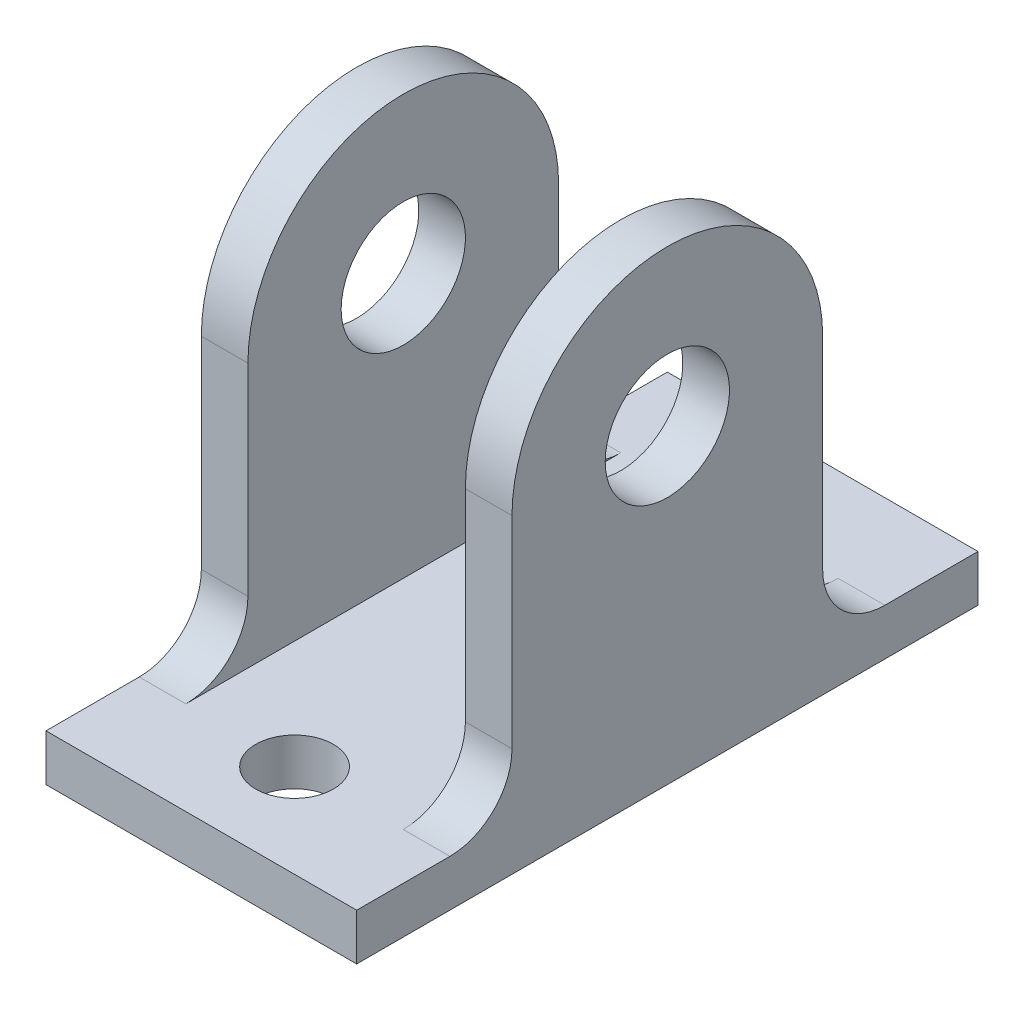
ISO-10303-21;
HEADER;
FILE_DESCRIPTION(('STEP AP214'),'2;1');
FILE_NAME('part.step','',(''),(''),'','','');
FILE_SCHEMA(('AUTOMOTIVE_DESIGN { 1 0 10303 214 1 1 1 1 }'));
ENDSEC;
DATA;
#1=APPLICATION_CONTEXT('core data for automotive mechanical design processes');
#2=APPLICATION_PROTOCOL_DEFINITION('international standard','automotive_design',2000,#1);
#3=PRODUCT_CONTEXT('',#1,'mechanical');
#4=PRODUCT('Part','Part','',(#3));
#5=PRODUCT_RELATED_PRODUCT_CATEGORY('part','',(#4));
#6=PRODUCT_DEFINITION_FORMATION('','',#4);
#7=PRODUCT_DEFINITION_CONTEXT('part definition',#1,'design');
#8=PRODUCT_DEFINITION('design','',#6,#7);
#9=PRODUCT_DEFINITION_SHAPE('','',#8);
#10=(LENGTH_UNIT() NAMED_UNIT(*) SI_UNIT(.MILLI.,.METRE.));
#11=(NAMED_UNIT(*) PLANE_ANGLE_UNIT() SI_UNIT($,.RADIAN.));
#12=(NAMED_UNIT(*) SI_UNIT($,.STERADIAN.) SOLID_ANGLE_UNIT());
#13=UNCERTAINTY_MEASURE_WITH_UNIT(LENGTH_MEASURE(1.E-05),#10,'distance_accuracy_value','');
#14=(GEOMETRIC_REPRESENTATION_CONTEXT(3) GLOBAL_UNCERTAINTY_ASSIGNED_CONTEXT((#13)) GLOBAL_UNIT_ASSIGNED_CONTEXT((#10,
#11,#12)) REPRESENTATION_CONTEXT('',''));
#15=CARTESIAN_POINT('',(0.,0.,0.));
#16=DIRECTION('',(0.,0.,1.));
#17=DIRECTION('',(1.,0.,0.));
#18=AXIS2_PLACEMENT_3D('',#15,#16,#17);
#19=CARTESIAN_POINT('',(7.21739130434782,-10.4021739130435,20.));
#20=DIRECTION('',(1.,0.,0.));
#21=DIRECTION('',(0.,1.,0.));
#22=AXIS2_PLACEMENT_3D('',#19,#20,#21);
#23=PLANE('',#22);
#24=CARTESIAN_POINT('',(7.21739130434782,-1.90217391304348,10.));
#25=DIRECTION('',(-1.,0.,0.));
#26=DIRECTION('',(0.,0.,1.));
#27=AXIS2_PLACEMENT_3D('',#24,#25,#26);
#28=CIRCLE('',#27,5.);
#29=CARTESIAN_POINT('',(7.21739130434782,-1.90217391304348,5.));
#30=VERTEX_POINT('',#29);
#31=CARTESIAN_POINT('',(7.21739130434782,-1.90217391304348,15.));
#32=VERTEX_POINT('',#31);
#33=EDGE_CURVE('E230',#30,#32,#28,.F.);
#34=ORIENTED_EDGE('',*,*,#33,.F.);
#35=DIRECTION('',(0.,1.,0.));
#36=VECTOR('',#35,1.);
#37=CARTESIAN_POINT('',(7.21739130434782,0.,5.));
#38=LINE('',#37,#36);
#39=CARTESIAN_POINT('',(7.21739130434782,-8.40217391304348,5.));
#40=VERTEX_POINT('',#39);
#41=EDGE_CURVE('E246',#30,#40,#38,.F.);
#42=ORIENTED_EDGE('',*,*,#41,.T.);
#43=CARTESIAN_POINT('',(7.21739130434782,-8.40217391304348,3.));
#44=DIRECTION('',(1.,0.,0.));
#45=DIRECTION('',(0.,0.,-1.));
#46=AXIS2_PLACEMENT_3D('',#43,#44,#45);
#47=CIRCLE('',#46,2.);
#48=CARTESIAN_POINT('',(7.21739130434782,-10.4021739130435,3.));
#49=VERTEX_POINT('',#48);
#50=EDGE_CURVE('E239',#40,#49,#47,.T.);
#51=ORIENTED_EDGE('',*,*,#50,.T.);
#52=DIRECTION('',(0.,0.,-1.));
#53=VECTOR('',#52,1.);
#54=CARTESIAN_POINT('',(7.21739130434782,-10.4021739130435,20.));
#55=LINE('',#54,#53);
#56=CARTESIAN_POINT('',(7.21739130434782,-10.4021739130435,17.));
#57=VERTEX_POINT('',#56);
#58=EDGE_CURVE('E272',#49,#57,#55,.F.);
#59=ORIENTED_EDGE('',*,*,#58,.T.);
#60=CARTESIAN_POINT('',(7.21739130434782,-8.40217391304348,17.));
#61=DIRECTION('',(-1.,0.,0.));
#62=DIRECTION('',(0.,0.,1.));
#63=AXIS2_PLACEMENT_3D('',#60,#61,#62);
#64=CIRCLE('',#63,2.);
#65=CARTESIAN_POINT('',(7.21739130434782,-8.40217391304348,15.));
#66=VERTEX_POINT('',#65);
#67=EDGE_CURVE('E235',#57,#66,#64,.F.);
#68=ORIENTED_EDGE('',*,*,#67,.T.);
#69=DIRECTION('',(0.,-1.,0.));
#70=VECTOR('',#69,1.);
#71=CARTESIAN_POINT('',(7.21739130434782,0.,15.));
#72=LINE('',#71,#70);
#73=EDGE_CURVE('E165',#32,#66,#72,.T.);
#74=ORIENTED_EDGE('',*,*,#73,.F.);
#75=EDGE_LOOP('',(#34,#42,#51,#59,#68,#74));
#76=FACE_BOUND('',#75,.T.);
#77=CARTESIAN_POINT('',(7.21739130434782,-1.90217391304348,10.));
#78=DIRECTION('',(-1.,0.,0.));
#79=DIRECTION('',(0.,0.,1.));
#80=AXIS2_PLACEMENT_3D('',#77,#78,#79);
#81=CIRCLE('',#80,2.);
#82=CARTESIAN_POINT('',(7.21739130434782,-1.90217391304348,12.));
#83=VERTEX_POINT('',#82);
#84=EDGE_CURVE('E161',#83,#83,#81,.F.);
#85=ORIENTED_EDGE('',*,*,#84,.T.);
#86=EDGE_LOOP('',(#85));
#87=FACE_BOUND('',#86,.T.);
#88=ADVANCED_FACE('F17',(#76,#87),#23,.F.);
#89=CARTESIAN_POINT('',(0.217391304347819,3.09782608695652,20.));
#90=DIRECTION('',(-1.,0.,0.));
#91=DIRECTION('',(0.,-1.,0.));
#92=AXIS2_PLACEMENT_3D('',#89,#90,#91);
#93=PLANE('',#92);
#94=DIRECTION('',(0.,-1.,0.));
#95=VECTOR('',#94,1.);
#96=CARTESIAN_POINT('',(0.21739130434782,0.,15.));
#97=LINE('',#96,#95);
#98=CARTESIAN_POINT('',(0.21739130434782,-8.40217391304348,15.));
#99=VERTEX_POINT('',#98);
#100=CARTESIAN_POINT('',(0.217391304347819,-1.90217391304348,15.));
#101=VERTEX_POINT('',#100);
#102=EDGE_CURVE('E143',#99,#101,#97,.F.);
#103=ORIENTED_EDGE('',*,*,#102,.F.);
#104=CARTESIAN_POINT('',(0.21739130434782,-8.40217391304348,17.));
#105=DIRECTION('',(-1.,0.,0.));
#106=DIRECTION('',(0.,0.,1.));
#107=AXIS2_PLACEMENT_3D('',#104,#105,#106);
#108=CIRCLE('',#107,2.);
#109=CARTESIAN_POINT('',(0.217391304347821,-10.4021739130435,17.));
#110=VERTEX_POINT('',#109);
#111=EDGE_CURVE('E128',#99,#110,#108,.T.);
#112=ORIENTED_EDGE('',*,*,#111,.T.);
#113=DIRECTION('',(0.,0.,-1.));
#114=VECTOR('',#113,1.);
#115=CARTESIAN_POINT('',(0.217391304347821,-10.4021739130435,20.));
#116=LINE('',#115,#114);
#117=CARTESIAN_POINT('',(0.217391304347821,-10.4021739130435,3.));
#118=VERTEX_POINT('',#117);
#119=EDGE_CURVE('E261',#110,#118,#116,.T.);
#120=ORIENTED_EDGE('',*,*,#119,.T.);
#121=CARTESIAN_POINT('',(0.21739130434782,-8.40217391304348,3.));
#122=DIRECTION('',(1.,0.,0.));
#123=DIRECTION('',(0.,0.,-1.));
#124=AXIS2_PLACEMENT_3D('',#121,#122,#123);
#125=CIRCLE('',#124,2.);
#126=CARTESIAN_POINT('',(0.21739130434782,-8.40217391304348,5.));
#127=VERTEX_POINT('',#126);
#128=EDGE_CURVE('E140',#118,#127,#125,.F.);
#129=ORIENTED_EDGE('',*,*,#128,.T.);
#130=DIRECTION('',(0.,1.,0.));
#131=VECTOR('',#130,1.);
#132=CARTESIAN_POINT('',(0.21739130434782,0.,5.));
#133=LINE('',#132,#131);
#134=CARTESIAN_POINT('',(0.217391304347819,-1.90217391304348,5.));
#135=VERTEX_POINT('',#134);
#136=EDGE_CURVE('E167',#127,#135,#133,.T.);
#137=ORIENTED_EDGE('',*,*,#136,.T.);
#138=CARTESIAN_POINT('',(0.217391304347819,-1.90217391304348,10.));
#139=DIRECTION('',(-1.,0.,0.));
#140=DIRECTION('',(0.,0.,1.));
#141=AXIS2_PLACEMENT_3D('',#138,#139,#140);
#142=CIRCLE('',#141,5.);
#143=EDGE_CURVE('E153',#101,#135,#142,.T.);
#144=ORIENTED_EDGE('',*,*,#143,.F.);
#145=EDGE_LOOP('',(#103,#112,#120,#129,#137,#144));
#146=FACE_BOUND('',#145,.T.);
#147=CARTESIAN_POINT('',(0.217391304347819,-1.90217391304348,10.));
#148=DIRECTION('',(-1.,0.,0.));
#149=DIRECTION('',(0.,0.,1.));
#150=AXIS2_PLACEMENT_3D('',#147,#148,#149);
#151=CIRCLE('',#150,2.);
#152=CARTESIAN_POINT('',(0.217391304347819,-1.90217391304348,12.));
#153=VERTEX_POINT('',#152);
#154=EDGE_CURVE('E20',#153,#153,#151,.T.);
#155=ORIENTED_EDGE('',*,*,#154,.T.);
#156=EDGE_LOOP('',(#155));
#157=FACE_BOUND('',#156,.T.);
#158=ADVANCED_FACE('F150',(#146,#157),#93,.F.);
#159=CARTESIAN_POINT('',(8.71739130434782,-1.90217391304348,10.));
#160=DIRECTION('',(-1.,0.,0.));
#161=DIRECTION('',(0.,0.,1.));
#162=AXIS2_PLACEMENT_3D('',#159,#160,#161);
#163=CYLINDRICAL_SURFACE('',#162,2.);
#164=ORIENTED_EDGE('',*,*,#154,.F.);
#165=EDGE_LOOP('',(#164));
#166=FACE_BOUND('',#165,.T.);
#167=CARTESIAN_POINT('',(-1.28260869565218,-1.90217391304348,10.));
#168=DIRECTION('',(-1.,0.,0.));
#169=DIRECTION('',(0.,0.,1.));
#170=AXIS2_PLACEMENT_3D('',#167,#168,#169);
#171=CIRCLE('',#170,2.);
#172=CARTESIAN_POINT('',(-1.28260869565218,-1.90217391304348,12.));
#173=VERTEX_POINT('',#172);
#174=EDGE_CURVE('E217',#173,#173,#171,.T.);
#175=ORIENTED_EDGE('',*,*,#174,.T.);
#176=EDGE_LOOP('',(#175));
#177=FACE_BOUND('',#176,.T.);
#178=ADVANCED_FACE('F597',(#166,#177),#163,.F.);
#179=CARTESIAN_POINT('',(0.217391304347821,-8.40217391304348,17.));
#180=DIRECTION('',(-1.,0.,0.));
#181=DIRECTION('',(0.,0.,1.));
#182=AXIS2_PLACEMENT_3D('',#179,#180,#181);
#183=CYLINDRICAL_SURFACE('',#182,2.);
#184=DIRECTION('',(1.,0.,0.));
#185=VECTOR('',#184,1.);
#186=CARTESIAN_POINT('',(8.71739130434782,-8.40217391304348,15.));
#187=LINE('',#186,#185);
#188=CARTESIAN_POINT('',(-1.28260869565218,-8.40217391304348,15.));
#189=VERTEX_POINT('',#188);
#190=EDGE_CURVE('E132',#189,#99,#187,.T.);
#191=ORIENTED_EDGE('',*,*,#190,.F.);
#192=CARTESIAN_POINT('',(-1.28260869565218,-8.40217391304348,17.));
#193=DIRECTION('',(-1.,0.,0.));
#194=DIRECTION('',(0.,0.,1.));
#195=AXIS2_PLACEMENT_3D('',#192,#193,#194);
#196=CIRCLE('',#195,2.);
#197=CARTESIAN_POINT('',(-1.28260869565218,-10.4021739130435,17.));
#198=VERTEX_POINT('',#197);
#199=EDGE_CURVE('E213',#189,#198,#196,.T.);
#200=ORIENTED_EDGE('',*,*,#199,.T.);
#201=DIRECTION('',(1.,0.,0.));
#202=VECTOR('',#201,1.);
#203=CARTESIAN_POINT('',(0.217391304347821,-10.4021739130435,17.));
#204=LINE('',#203,#202);
#205=EDGE_CURVE('E134',#198,#110,#204,.T.);
#206=ORIENTED_EDGE('',*,*,#205,.T.);
#207=ORIENTED_EDGE('',*,*,#111,.F.);
#208=EDGE_LOOP('',(#191,#200,#206,#207));
#209=FACE_BOUND('',#208,.T.);
#210=ADVANCED_FACE('F130',(#209),#183,.F.);
#211=CARTESIAN_POINT('',(8.71739130434782,-8.40217391304348,3.));
#212=DIRECTION('',(1.,0.,0.));
#213=DIRECTION('',(0.,0.,-1.));
#214=AXIS2_PLACEMENT_3D('',#211,#212,#213);
#215=CYLINDRICAL_SURFACE('',#214,2.);
#216=DIRECTION('',(1.,0.,0.));
#217=VECTOR('',#216,1.);
#218=CARTESIAN_POINT('',(0.217391304347821,-10.4021739130435,3.));
#219=LINE('',#218,#217);
#220=CARTESIAN_POINT('',(-1.28260869565218,-10.4021739130435,3.));
#221=VERTEX_POINT('',#220);
#222=EDGE_CURVE('E229',#118,#221,#219,.F.);
#223=ORIENTED_EDGE('',*,*,#222,.T.);
#224=CARTESIAN_POINT('',(-1.28260869565218,-8.40217391304348,3.));
#225=DIRECTION('',(1.,0.,0.));
#226=DIRECTION('',(0.,0.,-1.));
#227=AXIS2_PLACEMENT_3D('',#224,#225,#226);
#228=CIRCLE('',#227,2.);
#229=CARTESIAN_POINT('',(-1.28260869565218,-8.40217391304348,5.));
#230=VERTEX_POINT('',#229);
#231=EDGE_CURVE('E208',#221,#230,#228,.F.);
#232=ORIENTED_EDGE('',*,*,#231,.T.);
#233=DIRECTION('',(1.,0.,0.));
#234=VECTOR('',#233,1.);
#235=CARTESIAN_POINT('',(8.71739130434782,-8.40217391304348,5.));
#236=LINE('',#235,#234);
#237=EDGE_CURVE('E170',#230,#127,#236,.T.);
#238=ORIENTED_EDGE('',*,*,#237,.T.);
#239=ORIENTED_EDGE('',*,*,#128,.F.);
#240=EDGE_LOOP('',(#223,#232,#238,#239));
#241=FACE_BOUND('',#240,.T.);
#242=ADVANCED_FACE('F579',(#241),#215,.F.);
#243=CARTESIAN_POINT('',(8.71739130434782,0.,5.));
#244=DIRECTION('',(0.,0.,1.));
#245=DIRECTION('',(1.,0.,0.));
#246=AXIS2_PLACEMENT_3D('',#243,#244,#245);
#247=PLANE('',#246);
#248=ORIENTED_EDGE('',*,*,#237,.F.);
#249=DIRECTION('',(0.,1.,0.));
#250=VECTOR('',#249,1.);
#251=CARTESIAN_POINT('',(-1.28260869565218,-11.9021739130435,5.));
#252=LINE('',#251,#250);
#253=CARTESIAN_POINT('',(-1.28260869565218,-1.90217391304348,5.));
#254=VERTEX_POINT('',#253);
#255=EDGE_CURVE('E207',#230,#254,#252,.T.);
#256=ORIENTED_EDGE('',*,*,#255,.T.);
#257=DIRECTION('',(-1.,0.,0.));
#258=VECTOR('',#257,1.);
#259=CARTESIAN_POINT('',(8.71739130434782,-1.90217391304348,5.));
#260=LINE('',#259,#258);
#261=EDGE_CURVE('E148',#135,#254,#260,.T.);
#262=ORIENTED_EDGE('',*,*,#261,.F.);
#263=ORIENTED_EDGE('',*,*,#136,.F.);
#264=EDGE_LOOP('',(#248,#256,#262,#263));
#265=FACE_BOUND('',#264,.T.);
#266=ADVANCED_FACE('F569',(#265),#247,.F.);
#267=CARTESIAN_POINT('',(8.71739130434782,-1.90217391304348,10.));
#268=DIRECTION('',(-1.,0.,0.));
#269=DIRECTION('',(0.,0.,1.));
#270=AXIS2_PLACEMENT_3D('',#267,#268,#269);
#271=CYLINDRICAL_SURFACE('',#270,5.);
#272=ORIENTED_EDGE('',*,*,#143,.T.);
#273=ORIENTED_EDGE('',*,*,#261,.T.);
#274=CARTESIAN_POINT('',(-1.28260869565218,-1.90217391304348,10.));
#275=DIRECTION('',(-1.,0.,0.));
#276=DIRECTION('',(0.,0.,1.));
#277=AXIS2_PLACEMENT_3D('',#274,#275,#276);
#278=CIRCLE('',#277,5.);
#279=CARTESIAN_POINT('',(-1.28260869565218,-1.90217391304348,15.));
#280=VERTEX_POINT('',#279);
#281=EDGE_CURVE('E203',#254,#280,#278,.F.);
#282=ORIENTED_EDGE('',*,*,#281,.T.);
#283=DIRECTION('',(1.,0.,0.));
#284=VECTOR('',#283,1.);
#285=CARTESIAN_POINT('',(8.71739130434782,-1.90217391304348,15.));
#286=LINE('',#285,#284);
#287=EDGE_CURVE('E156',#101,#280,#286,.F.);
#288=ORIENTED_EDGE('',*,*,#287,.F.);
#289=EDGE_LOOP('',(#272,#273,#282,#288));
#290=FACE_BOUND('',#289,.T.);
#291=ADVANCED_FACE('F560',(#290),#271,.T.);
#292=CARTESIAN_POINT('',(8.71739130434782,0.,15.));
#293=DIRECTION('',(0.,0.,1.));
#294=DIRECTION('',(0.,-1.,0.));
#295=AXIS2_PLACEMENT_3D('',#292,#293,#294);
#296=PLANE('',#295);
#297=ORIENTED_EDGE('',*,*,#102,.T.);
#298=ORIENTED_EDGE('',*,*,#287,.T.);
#299=DIRECTION('',(0.,1.,0.));
#300=VECTOR('',#299,1.);
#301=CARTESIAN_POINT('',(-1.28260869565218,-11.9021739130435,15.));
#302=LINE('',#301,#300);
#303=EDGE_CURVE('E146',#280,#189,#302,.F.);
#304=ORIENTED_EDGE('',*,*,#303,.T.);
#305=ORIENTED_EDGE('',*,*,#190,.T.);
#306=EDGE_LOOP('',(#297,#298,#304,#305));
#307=FACE_BOUND('',#306,.T.);
#308=ADVANCED_FACE('F142',(#307),#296,.T.);
#309=CARTESIAN_POINT('',(8.71739130434782,-1.90217391304348,10.));
#310=DIRECTION('',(-1.,0.,0.));
#311=DIRECTION('',(0.,0.,1.));
#312=AXIS2_PLACEMENT_3D('',#309,#310,#311);
#313=CYLINDRICAL_SURFACE('',#312,2.);
#314=CARTESIAN_POINT('',(8.71739130434782,-1.90217391304348,10.));
#315=DIRECTION('',(-1.,0.,0.));
#316=DIRECTION('',(0.,0.,1.));
#317=AXIS2_PLACEMENT_3D('',#314,#315,#316);
#318=CIRCLE('',#317,2.);
#319=CARTESIAN_POINT('',(8.71739130434782,-1.90217391304348,12.));
#320=VERTEX_POINT('',#319);
#321=EDGE_CURVE('E198',#320,#320,#318,.F.);
#322=ORIENTED_EDGE('',*,*,#321,.T.);
#323=EDGE_LOOP('',(#322));
#324=FACE_BOUND('',#323,.T.);
#325=ORIENTED_EDGE('',*,*,#84,.F.);
#326=EDGE_LOOP('',(#325));
#327=FACE_BOUND('',#326,.T.);
#328=ADVANCED_FACE('F542',(#324,#327),#313,.F.);
#329=CARTESIAN_POINT('',(8.71739130434782,0.,5.));
#330=DIRECTION('',(0.,0.,1.));
#331=DIRECTION('',(1.,0.,0.));
#332=AXIS2_PLACEMENT_3D('',#329,#330,#331);
#333=PLANE('',#332);
#334=DIRECTION('',(1.,0.,0.));
#335=VECTOR('',#334,1.);
#336=CARTESIAN_POINT('',(8.71739130434782,-8.40217391304348,5.));
#337=LINE('',#336,#335);
#338=CARTESIAN_POINT('',(8.71739130434782,-8.40217391304348,5.));
#339=VERTEX_POINT('',#338);
#340=EDGE_CURVE('E242',#339,#40,#337,.F.);
#341=ORIENTED_EDGE('',*,*,#340,.T.);
#342=ORIENTED_EDGE('',*,*,#41,.F.);
#343=DIRECTION('',(-1.,0.,0.));
#344=VECTOR('',#343,1.);
#345=CARTESIAN_POINT('',(8.71739130434782,-1.90217391304348,5.));
#346=LINE('',#345,#344);
#347=CARTESIAN_POINT('',(8.71739130434782,-1.90217391304348,5.));
#348=VERTEX_POINT('',#347);
#349=EDGE_CURVE('E322',#348,#30,#346,.T.);
#350=ORIENTED_EDGE('',*,*,#349,.F.);
#351=DIRECTION('',(0.,-1.,0.));
#352=VECTOR('',#351,1.);
#353=CARTESIAN_POINT('',(8.71739130434782,3.09782608695652,5.));
#354=LINE('',#353,#352);
#355=EDGE_CURVE('E197',#348,#339,#354,.T.);
#356=ORIENTED_EDGE('',*,*,#355,.T.);
#357=EDGE_LOOP('',(#341,#342,#350,#356));
#358=FACE_BOUND('',#357,.T.);
#359=ADVANCED_FACE('F533',(#358),#333,.F.);
#360=CARTESIAN_POINT('',(8.71739130434782,-8.40217391304348,3.));
#361=DIRECTION('',(1.,0.,0.));
#362=DIRECTION('',(0.,0.,-1.));
#363=AXIS2_PLACEMENT_3D('',#360,#361,#362);
#364=CYLINDRICAL_SURFACE('',#363,2.);
#365=DIRECTION('',(1.,0.,0.));
#366=VECTOR('',#365,1.);
#367=CARTESIAN_POINT('',(0.217391304347821,-10.4021739130435,3.));
#368=LINE('',#367,#366);
#369=CARTESIAN_POINT('',(8.71739130434782,-10.4021739130435,3.));
#370=VERTEX_POINT('',#369);
#371=EDGE_CURVE('E275',#370,#49,#368,.F.);
#372=ORIENTED_EDGE('',*,*,#371,.T.);
#373=ORIENTED_EDGE('',*,*,#50,.F.);
#374=ORIENTED_EDGE('',*,*,#340,.F.);
#375=CARTESIAN_POINT('',(8.71739130434782,-8.40217391304348,3.));
#376=DIRECTION('',(1.,0.,0.));
#377=DIRECTION('',(0.,0.,-1.));
#378=AXIS2_PLACEMENT_3D('',#375,#376,#377);
#379=CIRCLE('',#378,2.);
#380=EDGE_CURVE('E192',#339,#370,#379,.T.);
#381=ORIENTED_EDGE('',*,*,#380,.T.);
#382=EDGE_LOOP('',(#372,#373,#374,#381));
#383=FACE_BOUND('',#382,.T.);
#384=ADVANCED_FACE('F395',(#383),#364,.F.);
#385=CARTESIAN_POINT('',(0.217391304347821,-8.40217391304348,17.));
#386=DIRECTION('',(-1.,0.,0.));
#387=DIRECTION('',(0.,0.,1.));
#388=AXIS2_PLACEMENT_3D('',#385,#386,#387);
#389=CYLINDRICAL_SURFACE('',#388,2.);
#390=DIRECTION('',(1.,0.,0.));
#391=VECTOR('',#390,1.);
#392=CARTESIAN_POINT('',(8.71739130434782,-8.40217391304348,15.));
#393=LINE('',#392,#391);
#394=CARTESIAN_POINT('',(8.71739130434782,-8.40217391304348,15.));
#395=VERTEX_POINT('',#394);
#396=EDGE_CURVE('E234',#66,#395,#393,.T.);
#397=ORIENTED_EDGE('',*,*,#396,.F.);
#398=ORIENTED_EDGE('',*,*,#67,.F.);
#399=DIRECTION('',(1.,0.,0.));
#400=VECTOR('',#399,1.);
#401=CARTESIAN_POINT('',(0.217391304347821,-10.4021739130435,17.));
#402=LINE('',#401,#400);
#403=CARTESIAN_POINT('',(8.71739130434782,-10.4021739130435,17.));
#404=VERTEX_POINT('',#403);
#405=EDGE_CURVE('E269',#57,#404,#402,.T.);
#406=ORIENTED_EDGE('',*,*,#405,.T.);
#407=CARTESIAN_POINT('',(8.71739130434782,-8.40217391304348,17.));
#408=DIRECTION('',(-1.,0.,0.));
#409=DIRECTION('',(0.,0.,1.));
#410=AXIS2_PLACEMENT_3D('',#407,#408,#409);
#411=CIRCLE('',#410,2.);
#412=EDGE_CURVE('E187',#404,#395,#411,.F.);
#413=ORIENTED_EDGE('',*,*,#412,.T.);
#414=EDGE_LOOP('',(#397,#398,#406,#413));
#415=FACE_BOUND('',#414,.T.);
#416=ADVANCED_FACE('F400',(#415),#389,.F.);
#417=CARTESIAN_POINT('',(8.71739130434782,0.,15.));
#418=DIRECTION('',(0.,0.,1.));
#419=DIRECTION('',(0.,-1.,0.));
#420=AXIS2_PLACEMENT_3D('',#417,#418,#419);
#421=PLANE('',#420);
#422=DIRECTION('',(0.,-1.,0.));
#423=VECTOR('',#422,1.);
#424=CARTESIAN_POINT('',(8.71739130434782,3.09782608695652,15.));
#425=LINE('',#424,#423);
#426=CARTESIAN_POINT('',(8.71739130434782,-1.90217391304348,15.));
#427=VERTEX_POINT('',#426);
#428=EDGE_CURVE('E186',#395,#427,#425,.F.);
#429=ORIENTED_EDGE('',*,*,#428,.T.);
#430=DIRECTION('',(-1.,0.,0.));
#431=VECTOR('',#430,1.);
#432=CARTESIAN_POINT('',(8.71739130434782,-1.90217391304348,15.));
#433=LINE('',#432,#431);
#434=EDGE_CURVE('E233',#32,#427,#433,.F.);
#435=ORIENTED_EDGE('',*,*,#434,.F.);
#436=ORIENTED_EDGE('',*,*,#73,.T.);
#437=ORIENTED_EDGE('',*,*,#396,.T.);
#438=EDGE_LOOP('',(#429,#435,#436,#437));
#439=FACE_BOUND('',#438,.T.);
#440=ADVANCED_FACE('F406',(#439),#421,.T.);
#441=CARTESIAN_POINT('',(8.71739130434782,-1.90217391304348,10.));
#442=DIRECTION('',(-1.,0.,0.));
#443=DIRECTION('',(0.,0.,1.));
#444=AXIS2_PLACEMENT_3D('',#441,#442,#443);
#445=CYLINDRICAL_SURFACE('',#444,5.);
#446=CARTESIAN_POINT('',(8.71739130434782,-1.90217391304348,10.));
#447=DIRECTION('',(-1.,0.,0.));
#448=DIRECTION('',(0.,0.,1.));
#449=AXIS2_PLACEMENT_3D('',#446,#447,#448);
#450=CIRCLE('',#449,5.);
#451=EDGE_CURVE('E181',#427,#348,#450,.T.);
#452=ORIENTED_EDGE('',*,*,#451,.T.);
#453=ORIENTED_EDGE('',*,*,#349,.T.);
#454=ORIENTED_EDGE('',*,*,#33,.T.);
#455=ORIENTED_EDGE('',*,*,#434,.T.);
#456=EDGE_LOOP('',(#452,#453,#454,#455));
#457=FACE_BOUND('',#456,.T.);
#458=ADVANCED_FACE('F404',(#457),#445,.T.);
#459=CARTESIAN_POINT('',(0.217391304347821,-10.4021739130435,20.));
#460=DIRECTION('',(0.,-1.,0.));
#461=DIRECTION('',(0.,0.,-1.));
#462=AXIS2_PLACEMENT_3D('',#459,#460,#461);
#463=PLANE('',#462);
#464=CARTESIAN_POINT('',(3.71739130434782,-10.4021739130435,3.));
#465=DIRECTION('',(0.,-1.,0.));
#466=DIRECTION('',(1.,0.,0.));
#467=AXIS2_PLACEMENT_3D('',#464,#465,#466);
#468=CIRCLE('',#467,1.25);
#469=CARTESIAN_POINT('',(4.96739130434782,-10.4021739130435,3.));
#470=VERTEX_POINT('',#469);
#471=EDGE_CURVE('E225',#470,#470,#468,.T.);
#472=ORIENTED_EDGE('',*,*,#471,.T.);
#473=EDGE_LOOP('',(#472));
#474=FACE_BOUND('',#473,.T.);
#475=ORIENTED_EDGE('',*,*,#222,.F.);
#476=ORIENTED_EDGE('',*,*,#119,.F.);
#477=ORIENTED_EDGE('',*,*,#205,.F.);
#478=DIRECTION('',(0.,0.,-1.));
#479=VECTOR('',#478,1.);
#480=CARTESIAN_POINT('',(-1.28260869565218,-10.4021739130435,20.));
#481=LINE('',#480,#479);
#482=CARTESIAN_POINT('',(-1.28260869565218,-10.4021739130435,20.));
#483=VERTEX_POINT('',#482);
#484=EDGE_CURVE('E216',#198,#483,#481,.F.);
#485=ORIENTED_EDGE('',*,*,#484,.T.);
#486=DIRECTION('',(-1.,0.,0.));
#487=VECTOR('',#486,1.);
#488=CARTESIAN_POINT('',(0.,-10.4021739130435,20.));
#489=LINE('',#488,#487);
#490=CARTESIAN_POINT('',(8.71739130434782,-10.4021739130435,20.));
#491=VERTEX_POINT('',#490);
#492=EDGE_CURVE('E202',#483,#491,#489,.F.);
#493=ORIENTED_EDGE('',*,*,#492,.T.);
#494=DIRECTION('',(0.,0.,1.));
#495=VECTOR('',#494,1.);
#496=CARTESIAN_POINT('',(8.71739130434782,-10.4021739130435,20.));
#497=LINE('',#496,#495);
#498=EDGE_CURVE('E191',#491,#404,#497,.F.);
#499=ORIENTED_EDGE('',*,*,#498,.T.);
#500=ORIENTED_EDGE('',*,*,#405,.F.);
#501=ORIENTED_EDGE('',*,*,#58,.F.);
#502=ORIENTED_EDGE('',*,*,#371,.F.);
#503=DIRECTION('',(0.,0.,1.));
#504=VECTOR('',#503,1.);
#505=CARTESIAN_POINT('',(8.71739130434782,-10.4021739130435,20.));
#506=LINE('',#505,#504);
#507=CARTESIAN_POINT('',(8.71739130434782,-10.4021739130435,0.));
#508=VERTEX_POINT('',#507);
#509=EDGE_CURVE('E196',#370,#508,#506,.F.);
#510=ORIENTED_EDGE('',*,*,#509,.T.);
#511=DIRECTION('',(-1.,0.,0.));
#512=VECTOR('',#511,1.);
#513=CARTESIAN_POINT('',(0.,-10.4021739130435,0.));
#514=LINE('',#513,#512);
#515=CARTESIAN_POINT('',(-1.28260869565218,-10.4021739130435,0.));
#516=VERTEX_POINT('',#515);
#517=EDGE_CURVE('E185',#516,#508,#514,.F.);
#518=ORIENTED_EDGE('',*,*,#517,.F.);
#519=DIRECTION('',(0.,0.,-1.));
#520=VECTOR('',#519,1.);
#521=CARTESIAN_POINT('',(-1.28260869565218,-10.4021739130435,20.));
#522=LINE('',#521,#520);
#523=EDGE_CURVE('E212',#516,#221,#522,.F.);
#524=ORIENTED_EDGE('',*,*,#523,.T.);
#525=EDGE_LOOP('',(#475,#476,#477,#485,#493,#499,#500,#501,#502,#510,#518,#524));
#526=FACE_BOUND('',#525,.T.);
#527=CARTESIAN_POINT('',(3.71739130434782,-10.4021739130435,17.));
#528=DIRECTION('',(0.,-1.,0.));
#529=DIRECTION('',(1.,0.,0.));
#530=AXIS2_PLACEMENT_3D('',#527,#528,#529);
#531=CIRCLE('',#530,1.25);
#532=CARTESIAN_POINT('',(4.96739130434782,-10.4021739130435,17.));
#533=VERTEX_POINT('',#532);
#534=EDGE_CURVE('E221',#533,#533,#531,.T.);
#535=ORIENTED_EDGE('',*,*,#534,.T.);
#536=EDGE_LOOP('',(#535));
#537=FACE_BOUND('',#536,.T.);
#538=ADVANCED_FACE('F389',(#474,#526,#537),#463,.F.);
#539=CARTESIAN_POINT('',(3.71739130434782,3.09782608695653,3.));
#540=DIRECTION('',(0.,-1.,0.));
#541=DIRECTION('',(1.,0.,0.));
#542=AXIS2_PLACEMENT_3D('',#539,#540,#541);
#543=CYLINDRICAL_SURFACE('',#542,1.25);
#544=ORIENTED_EDGE('',*,*,#471,.F.);
#545=EDGE_LOOP('',(#544));
#546=FACE_BOUND('',#545,.T.);
#547=CARTESIAN_POINT('',(3.71739130434782,-11.9021739130435,3.));
#548=DIRECTION('',(0.,-1.,0.));
#549=DIRECTION('',(1.,0.,0.));
#550=AXIS2_PLACEMENT_3D('',#547,#548,#549);
#551=CIRCLE('',#550,1.25);
#552=CARTESIAN_POINT('',(4.96739130434782,-11.9021739130435,3.));
#553=VERTEX_POINT('',#552);
#554=EDGE_CURVE('E176',#553,#553,#551,.T.);
#555=ORIENTED_EDGE('',*,*,#554,.T.);
#556=EDGE_LOOP('',(#555));
#557=FACE_BOUND('',#556,.T.);
#558=ADVANCED_FACE('F434',(#546,#557),#543,.F.);
#559=CARTESIAN_POINT('',(3.71739130434782,3.09782608695653,17.));
#560=DIRECTION('',(0.,-1.,0.));
#561=DIRECTION('',(1.,0.,0.));
#562=AXIS2_PLACEMENT_3D('',#559,#560,#561);
#563=CYLINDRICAL_SURFACE('',#562,1.25);
#564=ORIENTED_EDGE('',*,*,#534,.F.);
#565=EDGE_LOOP('',(#564));
#566=FACE_BOUND('',#565,.T.);
#567=CARTESIAN_POINT('',(3.71739130434782,-11.9021739130435,17.));
#568=DIRECTION('',(0.,-1.,0.));
#569=DIRECTION('',(1.,0.,0.));
#570=AXIS2_PLACEMENT_3D('',#567,#568,#569);
#571=CIRCLE('',#570,1.25);
#572=CARTESIAN_POINT('',(4.96739130434782,-11.9021739130435,17.));
#573=VERTEX_POINT('',#572);
#574=EDGE_CURVE('E171',#573,#573,#571,.T.);
#575=ORIENTED_EDGE('',*,*,#574,.T.);
#576=EDGE_LOOP('',(#575));
#577=FACE_BOUND('',#576,.T.);
#578=ADVANCED_FACE('F431',(#566,#577),#563,.F.);
#579=CARTESIAN_POINT('',(-1.28260869565218,-11.9021739130435,20.));
#580=DIRECTION('',(1.,0.,0.));
#581=DIRECTION('',(0.,0.,-1.));
#582=AXIS2_PLACEMENT_3D('',#579,#580,#581);
#583=PLANE('',#582);
#584=ORIENTED_EDGE('',*,*,#281,.F.);
#585=ORIENTED_EDGE('',*,*,#255,.F.);
#586=ORIENTED_EDGE('',*,*,#231,.F.);
#587=ORIENTED_EDGE('',*,*,#523,.F.);
#588=DIRECTION('',(0.,1.,0.));
#589=VECTOR('',#588,1.);
#590=CARTESIAN_POINT('',(-1.28260869565218,0.,0.));
#591=LINE('',#590,#589);
#592=CARTESIAN_POINT('',(-1.28260869565218,-11.9021739130435,0.));
#593=VERTEX_POINT('',#592);
#594=EDGE_CURVE('E180',#593,#516,#591,.T.);
#595=ORIENTED_EDGE('',*,*,#594,.F.);
#596=DIRECTION('',(0.,0.,1.));
#597=VECTOR('',#596,1.);
#598=CARTESIAN_POINT('',(-1.28260869565218,-11.9021739130435,20.));
#599=LINE('',#598,#597);
#600=CARTESIAN_POINT('',(-1.28260869565218,-11.9021739130435,20.));
#601=VERTEX_POINT('',#600);
#602=EDGE_CURVE('E175',#593,#601,#599,.T.);
#603=ORIENTED_EDGE('',*,*,#602,.T.);
#604=DIRECTION('',(0.,1.,0.));
#605=VECTOR('',#604,1.);
#606=CARTESIAN_POINT('',(-1.28260869565218,0.,20.));
#607=LINE('',#606,#605);
#608=EDGE_CURVE('E293',#601,#483,#607,.T.);
#609=ORIENTED_EDGE('',*,*,#608,.T.);
#610=ORIENTED_EDGE('',*,*,#484,.F.);
#611=ORIENTED_EDGE('',*,*,#199,.F.);
#612=ORIENTED_EDGE('',*,*,#303,.F.);
#613=EDGE_LOOP('',(#584,#585,#586,#587,#595,#603,#609,#610,#611,#612));
#614=FACE_BOUND('',#613,.T.);
#615=ORIENTED_EDGE('',*,*,#174,.F.);
#616=EDGE_LOOP('',(#615));
#617=FACE_BOUND('',#616,.T.);
#618=ADVANCED_FACE('F428',(#614,#617),#583,.F.);
#619=CARTESIAN_POINT('',(0.,0.,20.));
#620=DIRECTION('',(0.,0.,-1.));
#621=DIRECTION('',(-1.,0.,0.));
#622=AXIS2_PLACEMENT_3D('',#619,#620,#621);
#623=PLANE('',#622);
#624=ORIENTED_EDGE('',*,*,#608,.F.);
#625=DIRECTION('',(-1.,0.,0.));
#626=VECTOR('',#625,1.);
#627=CARTESIAN_POINT('',(8.71739130434782,-11.9021739130435,20.));
#628=LINE('',#627,#626);
#629=CARTESIAN_POINT('',(8.71739130434782,-11.9021739130435,20.));
#630=VERTEX_POINT('',#629);
#631=EDGE_CURVE('E302',#601,#630,#628,.F.);
#632=ORIENTED_EDGE('',*,*,#631,.T.);
#633=DIRECTION('',(0.,-1.,0.));
#634=VECTOR('',#633,1.);
#635=CARTESIAN_POINT('',(8.71739130434782,3.09782608695652,20.));
#636=LINE('',#635,#634);
#637=EDGE_CURVE('E331',#630,#491,#636,.F.);
#638=ORIENTED_EDGE('',*,*,#637,.T.);
#639=ORIENTED_EDGE('',*,*,#492,.F.);
#640=EDGE_LOOP('',(#624,#632,#638,#639));
#641=FACE_BOUND('',#640,.T.);
#642=ADVANCED_FACE('F375',(#641),#623,.F.);
#643=CARTESIAN_POINT('',(8.71739130434782,3.09782608695652,20.));
#644=DIRECTION('',(-1.,0.,0.));
#645=DIRECTION('',(0.,-1.,0.));
#646=AXIS2_PLACEMENT_3D('',#643,#644,#645);
#647=PLANE('',#646);
#648=ORIENTED_EDGE('',*,*,#428,.F.);
#649=ORIENTED_EDGE('',*,*,#412,.F.);
#650=ORIENTED_EDGE('',*,*,#498,.F.);
#651=ORIENTED_EDGE('',*,*,#637,.F.);
#652=DIRECTION('',(0.,0.,1.));
#653=VECTOR('',#652,1.);
#654=CARTESIAN_POINT('',(8.71739130434782,-11.9021739130435,20.));
#655=LINE('',#654,#653);
#656=CARTESIAN_POINT('',(8.71739130434782,-11.9021739130435,0.));
#657=VERTEX_POINT('',#656);
#658=EDGE_CURVE('E27',#630,#657,#655,.F.);
#659=ORIENTED_EDGE('',*,*,#658,.T.);
#660=DIRECTION('',(0.,1.,0.));
#661=VECTOR('',#660,1.);
#662=CARTESIAN_POINT('',(8.71739130434782,0.,0.));
#663=LINE('',#662,#661);
#664=EDGE_CURVE('E35',#508,#657,#663,.F.);
#665=ORIENTED_EDGE('',*,*,#664,.F.);
#666=ORIENTED_EDGE('',*,*,#509,.F.);
#667=ORIENTED_EDGE('',*,*,#380,.F.);
#668=ORIENTED_EDGE('',*,*,#355,.F.);
#669=ORIENTED_EDGE('',*,*,#451,.F.);
#670=EDGE_LOOP('',(#648,#649,#650,#651,#659,#665,#666,#667,#668,#669));
#671=FACE_BOUND('',#670,.T.);
#672=ORIENTED_EDGE('',*,*,#321,.F.);
#673=EDGE_LOOP('',(#672));
#674=FACE_BOUND('',#673,.T.);
#675=ADVANCED_FACE('F379',(#671,#674),#647,.F.);
#676=CARTESIAN_POINT('',(0.,0.,0.));
#677=DIRECTION('',(0.,0.,-1.));
#678=DIRECTION('',(-1.,0.,0.));
#679=AXIS2_PLACEMENT_3D('',#676,#677,#678);
#680=PLANE('',#679);
#681=DIRECTION('',(-1.,0.,0.));
#682=VECTOR('',#681,1.);
#683=CARTESIAN_POINT('',(8.71739130434782,-11.9021739130435,0.));
#684=LINE('',#683,#682);
#685=EDGE_CURVE('E11',#657,#593,#684,.T.);
#686=ORIENTED_EDGE('',*,*,#685,.T.);
#687=ORIENTED_EDGE('',*,*,#594,.T.);
#688=ORIENTED_EDGE('',*,*,#517,.T.);
#689=ORIENTED_EDGE('',*,*,#664,.T.);
#690=EDGE_LOOP('',(#686,#687,#688,#689));
#691=FACE_BOUND('',#690,.T.);
#692=ADVANCED_FACE('F385',(#691),#680,.T.);
#693=CARTESIAN_POINT('',(8.71739130434782,-11.9021739130435,20.));
#694=DIRECTION('',(0.,1.,0.));
#695=DIRECTION('',(-1.,0.,0.));
#696=AXIS2_PLACEMENT_3D('',#693,#694,#695);
#697=PLANE('',#696);
#698=ORIENTED_EDGE('',*,*,#658,.F.);
#699=ORIENTED_EDGE('',*,*,#631,.F.);
#700=ORIENTED_EDGE('',*,*,#602,.F.);
#701=ORIENTED_EDGE('',*,*,#685,.F.);
#702=EDGE_LOOP('',(#698,#699,#700,#701));
#703=FACE_BOUND('',#702,.T.);
#704=ORIENTED_EDGE('',*,*,#574,.F.);
#705=EDGE_LOOP('',(#704));
#706=FACE_BOUND('',#705,.T.);
#707=ORIENTED_EDGE('',*,*,#554,.F.);
#708=EDGE_LOOP('',(#707));
#709=FACE_BOUND('',#708,.T.);
#710=ADVANCED_FACE('F383',(#703,#706,#709),#697,.F.);
#711=CLOSED_SHELL('',(#88,#158,#178,#210,#242,#266,#291,#308,#328,#359,#384,#416,#440,#458,#538,
#558,#578,#618,#642,#675,#692,#710));
#712=MANIFOLD_SOLID_BREP('B1',#711);
#713=ADVANCED_BREP_SHAPE_REPRESENTATION('',(#18,#712),#14);
#714=SHAPE_DEFINITION_REPRESENTATION(#9,#713);
ENDSEC;
END-ISO-10303-21;
